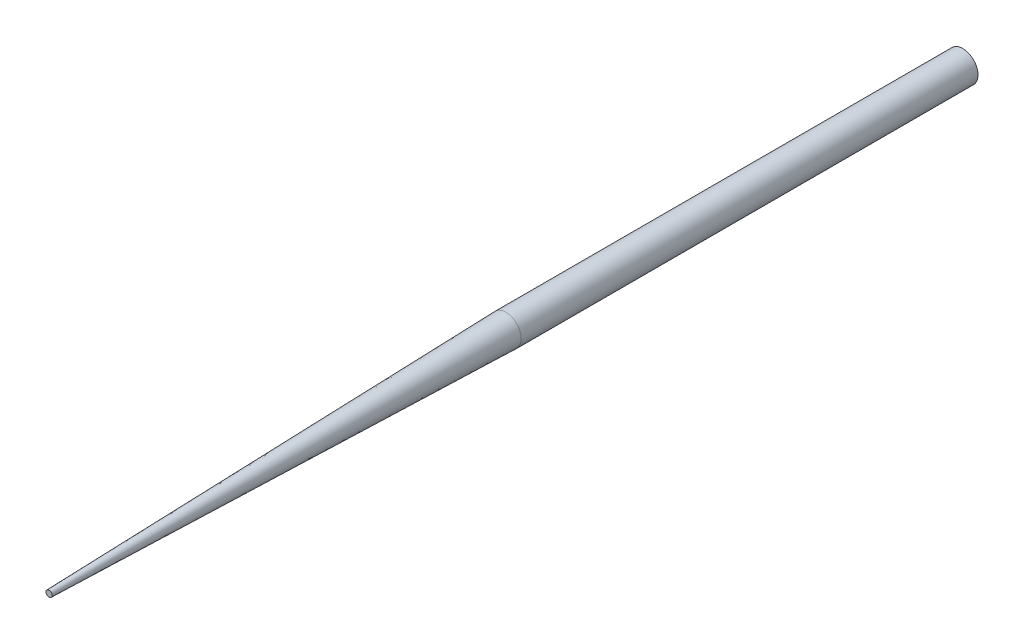
ISO-10303-21;
HEADER;
FILE_DESCRIPTION(('STEP AP214'),'2;1');
FILE_NAME('part.step','',(''),(''),'','','');
FILE_SCHEMA(('AUTOMOTIVE_DESIGN { 1 0 10303 214 1 1 1 1 }'));
ENDSEC;
DATA;
#1=APPLICATION_CONTEXT('core data for automotive mechanical design processes');
#2=APPLICATION_PROTOCOL_DEFINITION('international standard','automotive_design',2000,#1);
#3=PRODUCT_CONTEXT('',#1,'mechanical');
#4=PRODUCT('Part','Part','',(#3));
#5=PRODUCT_RELATED_PRODUCT_CATEGORY('part','',(#4));
#6=PRODUCT_DEFINITION_FORMATION('','',#4);
#7=PRODUCT_DEFINITION_CONTEXT('part definition',#1,'design');
#8=PRODUCT_DEFINITION('design','',#6,#7);
#9=PRODUCT_DEFINITION_SHAPE('','',#8);
#10=(LENGTH_UNIT() NAMED_UNIT(*) SI_UNIT(.MILLI.,.METRE.));
#11=(NAMED_UNIT(*) PLANE_ANGLE_UNIT() SI_UNIT($,.RADIAN.));
#12=(NAMED_UNIT(*) SI_UNIT($,.STERADIAN.) SOLID_ANGLE_UNIT());
#13=UNCERTAINTY_MEASURE_WITH_UNIT(LENGTH_MEASURE(1.E-05),#10,'distance_accuracy_value','');
#14=(GEOMETRIC_REPRESENTATION_CONTEXT(3) GLOBAL_UNCERTAINTY_ASSIGNED_CONTEXT((#13)) GLOBAL_UNIT_ASSIGNED_CONTEXT((#10,
#11,#12)) REPRESENTATION_CONTEXT('',''));
#15=CARTESIAN_POINT('',(0.,0.,0.));
#16=DIRECTION('',(0.,0.,1.));
#17=DIRECTION('',(1.,0.,0.));
#18=AXIS2_PLACEMENT_3D('',#15,#16,#17);
#19=CARTESIAN_POINT('',(0.,0.,30.));
#20=DIRECTION('',(0.,0.,-1.));
#21=DIRECTION('',(-1.,0.,0.));
#22=AXIS2_PLACEMENT_3D('',#19,#20,#21);
#23=CYLINDRICAL_SURFACE('',#22,0.5);
#24=CARTESIAN_POINT('',(0.,0.,14.9999999999948));
#25=DIRECTION('',(0.,0.,1.));
#26=DIRECTION('',(1.,0.,0.));
#27=AXIS2_PLACEMENT_3D('',#24,#25,#26);
#28=CIRCLE('',#27,0.5);
#29=CARTESIAN_POINT('',(-0.5,0.,14.9999999999948));
#30=VERTEX_POINT('',#29);
#31=EDGE_CURVE('E10',#30,#30,#28,.F.);
#32=ORIENTED_EDGE('',*,*,#31,.T.);
#33=EDGE_LOOP('',(#32));
#34=FACE_BOUND('',#33,.T.);
#35=CARTESIAN_POINT('',(0.,0.,0.));
#36=DIRECTION('',(0.,0.,1.));
#37=DIRECTION('',(1.,0.,0.));
#38=AXIS2_PLACEMENT_3D('',#35,#36,#37);
#39=CIRCLE('',#38,0.5);
#40=CARTESIAN_POINT('',(0.5,0.,0.));
#41=VERTEX_POINT('',#40);
#42=EDGE_CURVE('E42',#41,#41,#39,.T.);
#43=ORIENTED_EDGE('',*,*,#42,.T.);
#44=EDGE_LOOP('',(#43));
#45=FACE_BOUND('',#44,.T.);
#46=ADVANCED_FACE('F31',(#34,#45),#23,.T.);
#47=CARTESIAN_POINT('',(0.,0.,30.));
#48=DIRECTION('',(0.,0.,1.));
#49=DIRECTION('',(1.,0.,0.));
#50=AXIS2_PLACEMENT_3D('',#47,#48,#49);
#51=PLANE('',#50);
#52=CARTESIAN_POINT('',(0.,0.,30.));
#53=DIRECTION('',(0.,0.,1.));
#54=DIRECTION('',(1.,0.,0.));
#55=AXIS2_PLACEMENT_3D('',#52,#53,#54);
#56=CIRCLE('',#55,0.0999999999999144);
#57=CARTESIAN_POINT('',(-0.0999999999999144,0.,30.));
#58=VERTEX_POINT('',#57);
#59=EDGE_CURVE('E38',#58,#58,#56,.T.);
#60=ORIENTED_EDGE('',*,*,#59,.T.);
#61=EDGE_LOOP('',(#60));
#62=FACE_BOUND('',#61,.T.);
#63=ADVANCED_FACE('F52',(#62),#51,.T.);
#64=CARTESIAN_POINT('',(0.,0.,0.));
#65=DIRECTION('',(0.,0.,1.));
#66=DIRECTION('',(1.,0.,0.));
#67=AXIS2_PLACEMENT_3D('',#64,#65,#66);
#68=PLANE('',#67);
#69=ORIENTED_EDGE('',*,*,#42,.F.);
#70=EDGE_LOOP('',(#69));
#71=FACE_BOUND('',#70,.T.);
#72=ADVANCED_FACE('F50',(#71),#68,.F.);
#73=CARTESIAN_POINT('',(0.,0.,30.));
#74=DIRECTION('',(0.,0.,-1.));
#75=DIRECTION('',(-1.,0.,0.));
#76=AXIS2_PLACEMENT_3D('',#73,#74,#75);
#77=CONICAL_SURFACE('',#76,0.0999999999999144,0.0266603483745945);
#78=CARTESIAN_POINT('',(-0.5,0.,14.9999999999948));
#79=CARTESIAN_POINT('',(-0.495833333333333,0.,15.1562499999949));
#80=CARTESIAN_POINT('',(-0.491666666666665,0.,15.3124999999949));
#81=CARTESIAN_POINT('',(-0.48333333333333,0.,15.624999999995));
#82=CARTESIAN_POINT('',(-0.479166666666662,0.,15.7812499999951));
#83=CARTESIAN_POINT('',(-0.470833333333327,0.,16.0937499999952));
#84=CARTESIAN_POINT('',(-0.46666666666666,0.,16.2499999999953));
#85=CARTESIAN_POINT('',(-0.458333333333324,0.,16.5624999999954));
#86=CARTESIAN_POINT('',(-0.454166666666657,0.,16.7187499999954));
#87=CARTESIAN_POINT('',(-0.445833333333322,0.,17.0312499999955));
#88=CARTESIAN_POINT('',(-0.441666666666654,0.,17.1874999999956));
#89=CARTESIAN_POINT('',(-0.433333333333319,0.,17.4999999999957));
#90=CARTESIAN_POINT('',(-0.429166666666652,0.,17.6562499999957));
#91=CARTESIAN_POINT('',(-0.420833333333316,0.,17.9687499999959));
#92=CARTESIAN_POINT('',(-0.416666666666649,0.,18.1249999999959));
#93=CARTESIAN_POINT('',(-0.408333333333314,0.,18.437499999996));
#94=CARTESIAN_POINT('',(-0.404166666666646,0.,18.5937499999961));
#95=CARTESIAN_POINT('',(-0.395833333333311,0.,18.9062499999962));
#96=CARTESIAN_POINT('',(-0.391666666666643,0.,19.0624999999962));
#97=CARTESIAN_POINT('',(-0.383333333333308,0.,19.3749999999963));
#98=CARTESIAN_POINT('',(-0.379166666666641,0.,19.5312499999964));
#99=CARTESIAN_POINT('',(-0.370833333333306,0.,19.8437499999965));
#100=CARTESIAN_POINT('',(-0.366666666666638,0.,19.9999999999966));
#101=CARTESIAN_POINT('',(-0.358333333333303,0.,20.3124999999967));
#102=CARTESIAN_POINT('',(-0.354166666666635,0.,20.4687499999967));
#103=CARTESIAN_POINT('',(-0.3458333333333,0.,20.7812499999968));
#104=CARTESIAN_POINT('',(-0.341666666666633,0.,20.9374999999969));
#105=CARTESIAN_POINT('',(-0.333333333333298,0.,21.249999999997));
#106=CARTESIAN_POINT('',(-0.32916666666663,0.,21.406249999997));
#107=CARTESIAN_POINT('',(-0.320833333333295,0.,21.7187499999971));
#108=CARTESIAN_POINT('',(-0.316666666666628,0.,21.8749999999972));
#109=CARTESIAN_POINT('',(-0.308333333333292,0.,22.1874999999973));
#110=CARTESIAN_POINT('',(-0.304166666666625,0.,22.3437499999974));
#111=CARTESIAN_POINT('',(-0.29583333333329,0.,22.6562499999975));
#112=CARTESIAN_POINT('',(-0.291666666666622,0.,22.8124999999975));
#113=CARTESIAN_POINT('',(-0.283333333333287,0.,23.1249999999976));
#114=CARTESIAN_POINT('',(-0.279166666666619,0.,23.2812499999977));
#115=CARTESIAN_POINT('',(-0.270833333333284,0.,23.5937499999978));
#116=CARTESIAN_POINT('',(-0.266666666666617,0.,23.7499999999978));
#117=CARTESIAN_POINT('',(-0.258333333333282,0.,24.062499999998));
#118=CARTESIAN_POINT('',(-0.254166666666614,0.,24.218749999998));
#119=CARTESIAN_POINT('',(-0.245833333333279,0.,24.5312499999981));
#120=CARTESIAN_POINT('',(-0.241666666666611,0.,24.6874999999982));
#121=CARTESIAN_POINT('',(-0.233333333333276,0.,24.9999999999983));
#122=CARTESIAN_POINT('',(-0.229166666666609,0.,25.1562499999983));
#123=CARTESIAN_POINT('',(-0.220833333333274,0.,25.4687499999984));
#124=CARTESIAN_POINT('',(-0.216666666666606,0.,25.6249999999985));
#125=CARTESIAN_POINT('',(-0.208333333333271,0.,25.9374999999986));
#126=CARTESIAN_POINT('',(-0.204166666666603,0.,26.0937499999986));
#127=CARTESIAN_POINT('',(-0.195833333333268,0.,26.4062499999988));
#128=CARTESIAN_POINT('',(-0.191666666666601,0.,26.5624999999988));
#129=CARTESIAN_POINT('',(-0.183333333333266,0.,26.8749999999989));
#130=CARTESIAN_POINT('',(-0.179166666666598,0.,27.031249999999));
#131=CARTESIAN_POINT('',(-0.170833333333263,0.,27.3437499999991));
#132=CARTESIAN_POINT('',(-0.166666666666595,0.,27.4999999999991));
#133=CARTESIAN_POINT('',(-0.15833333333326,0.,27.8124999999992));
#134=CARTESIAN_POINT('',(-0.154166666666593,0.,27.9687499999993));
#135=CARTESIAN_POINT('',(-0.145833333333258,0.,28.2812499999994));
#136=CARTESIAN_POINT('',(-0.14166666666659,0.,28.4374999999995));
#137=CARTESIAN_POINT('',(-0.133333333333255,0.,28.7499999999996));
#138=CARTESIAN_POINT('',(-0.129166666666587,0.,28.9062499999996));
#139=CARTESIAN_POINT('',(-0.120833333333252,0.,29.2187499999997));
#140=CARTESIAN_POINT('',(-0.116666666666585,0.,29.3749999999998));
#141=CARTESIAN_POINT('',(-0.10833333333325,0.,29.6874999999999));
#142=CARTESIAN_POINT('',(-0.104166666666582,0.,29.8437499999999));
#143=CARTESIAN_POINT('',(-0.0999999999999144,0.,30.));
#144=B_SPLINE_CURVE_WITH_KNOTS('',3,(#78,#79,#80,#81,#82,#83,#84,#85,#86,#87,#88,#89,#90,#91,
#92,#93,#94,#95,#96,#97,#98,#99,#100,#101,#102,#103,#104,#105,#106,#107,#108,#109,#110,#111,
#112,#113,#114,#115,#116,#117,#118,#119,#120,#121,#122,#123,#124,#125,#126,#127,#128,#129,#130,
#131,#132,#133,#134,#135,#136,#137,#138,#139,#140,#141,#142,#143),.UNSPECIFIED.,.F.,.F.,(4,2,2,
2,2,2,2,2,2,2,2,2,2,2,2,2,2,2,2,2,2,2,2,2,2,2,2,2,2,2,2,2,4),(0.,0.468916637047729,
0.937833274095458,1.40674991114319,1.87566654819092,2.34458318523864,2.81349982228637,
3.2824164593341,3.75133309638183,4.22024973342956,4.68916637047729,5.15808300752502,
5.62699964457275,6.09591628162047,6.56483291866821,7.03374955571593,7.50266619276366,
7.97158282981139,8.44049946685912,8.90941610390685,9.37833274095457,9.8472493780023,
10.31616601505,10.7850826520978,11.2539992891455,11.7229159261932,12.1918325632409,
12.6607492002887,13.1296658373364,13.5985824743841,14.0674991114319,14.5364157484796,
15.0053323855273),.UNSPECIFIED.);
#145=EDGE_CURVE('BSEAM33',#30,#58,#144,.T.);
#146=ORIENTED_EDGE('',*,*,#31,.F.);
#147=ORIENTED_EDGE('',*,*,#59,.F.);
#148=ORIENTED_EDGE('',*,*,#145,.T.);
#149=ORIENTED_EDGE('',*,*,#145,.F.);
#150=EDGE_LOOP('',(#146,#148,#147,#149));
#151=FACE_BOUND('',#150,.T.);
#152=ADVANCED_FACE('F33',(#151),#77,.T.);
#153=CLOSED_SHELL('',(#46,#63,#72,#152));
#154=MANIFOLD_SOLID_BREP('B2',#153);
#155=ADVANCED_BREP_SHAPE_REPRESENTATION('',(#18,#154),#14);
#156=SHAPE_DEFINITION_REPRESENTATION(#9,#155);
ENDSEC;
END-ISO-10303-21;
